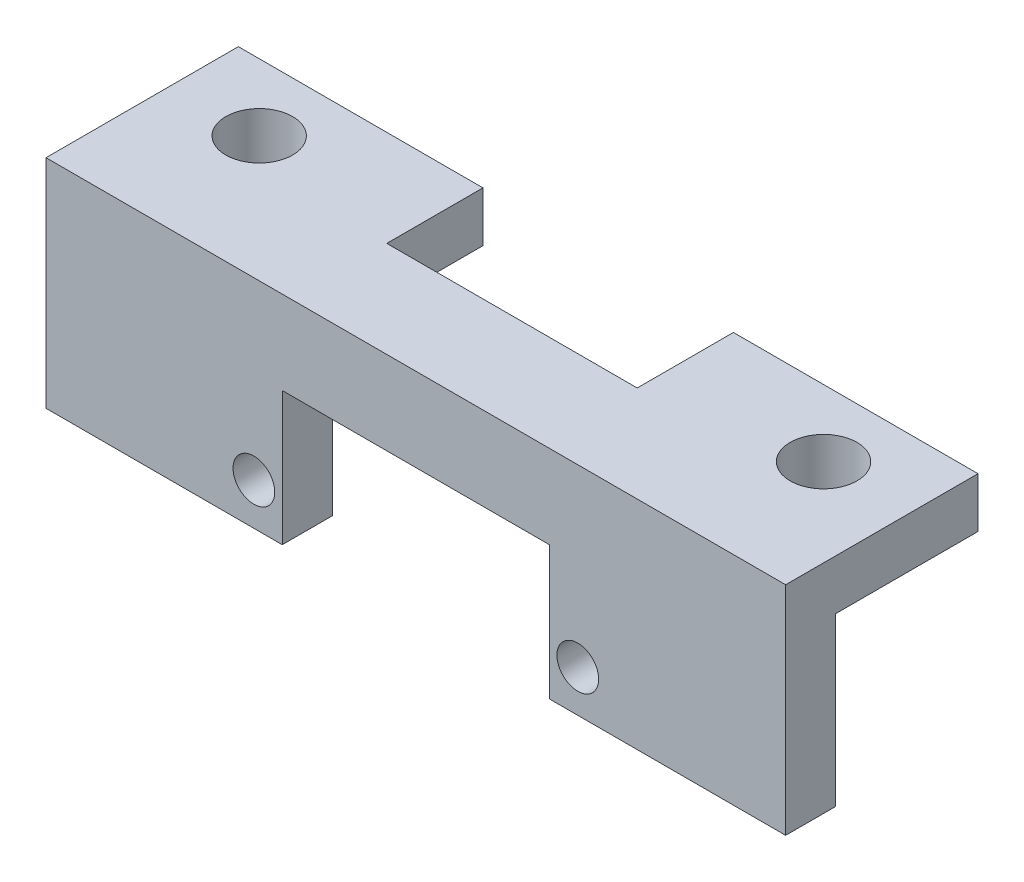
ISO-10303-21;
HEADER;
FILE_DESCRIPTION(('STEP AP214'),'2;1');
FILE_NAME('part.step','',(''),(''),'','','');
FILE_SCHEMA(('AUTOMOTIVE_DESIGN { 1 0 10303 214 1 1 1 1 }'));
ENDSEC;
DATA;
#1=APPLICATION_CONTEXT('core data for automotive mechanical design processes');
#2=APPLICATION_PROTOCOL_DEFINITION('international standard','automotive_design',2000,#1);
#3=PRODUCT_CONTEXT('',#1,'mechanical');
#4=PRODUCT('Part','Part','',(#3));
#5=PRODUCT_RELATED_PRODUCT_CATEGORY('part','',(#4));
#6=PRODUCT_DEFINITION_FORMATION('','',#4);
#7=PRODUCT_DEFINITION_CONTEXT('part definition',#1,'design');
#8=PRODUCT_DEFINITION('design','',#6,#7);
#9=PRODUCT_DEFINITION_SHAPE('','',#8);
#10=(LENGTH_UNIT() NAMED_UNIT(*) SI_UNIT(.MILLI.,.METRE.));
#11=(NAMED_UNIT(*) PLANE_ANGLE_UNIT() SI_UNIT($,.RADIAN.));
#12=(NAMED_UNIT(*) SI_UNIT($,.STERADIAN.) SOLID_ANGLE_UNIT());
#13=UNCERTAINTY_MEASURE_WITH_UNIT(LENGTH_MEASURE(1.E-05),#10,'distance_accuracy_value','');
#14=(GEOMETRIC_REPRESENTATION_CONTEXT(3) GLOBAL_UNCERTAINTY_ASSIGNED_CONTEXT((#13)) GLOBAL_UNIT_ASSIGNED_CONTEXT((#10,
#11,#12)) REPRESENTATION_CONTEXT('',''));
#15=CARTESIAN_POINT('',(0.,0.,0.));
#16=DIRECTION('',(0.,0.,1.));
#17=DIRECTION('',(1.,0.,0.));
#18=AXIS2_PLACEMENT_3D('',#15,#16,#17);
#19=CARTESIAN_POINT('',(0.,-10.,0.));
#20=DIRECTION('',(0.,-1.,0.));
#21=DIRECTION('',(0.,0.,-1.));
#22=AXIS2_PLACEMENT_3D('',#19,#20,#21);
#23=PLANE('',#22);
#24=DIRECTION('',(0.,0.,1.));
#25=VECTOR('',#24,1.);
#26=CARTESIAN_POINT('',(-8.,-10.,-15.1285438199983));
#27=LINE('',#26,#25);
#28=CARTESIAN_POINT('',(-8.,-10.,2.76000000000001));
#29=VERTEX_POINT('',#28);
#30=CARTESIAN_POINT('',(-8.,-10.,5.76));
#31=VERTEX_POINT('',#30);
#32=EDGE_CURVE('E138',#29,#31,#27,.T.);
#33=ORIENTED_EDGE('',*,*,#32,.T.);
#34=DIRECTION('',(-1.,0.,0.));
#35=VECTOR('',#34,1.);
#36=CARTESIAN_POINT('',(-22.15,-10.,5.76000000000001));
#37=LINE('',#36,#35);
#38=CARTESIAN_POINT('',(-22.15,-10.,5.76000000000001));
#39=VERTEX_POINT('',#38);
#40=EDGE_CURVE('E152',#31,#39,#37,.T.);
#41=ORIENTED_EDGE('',*,*,#40,.T.);
#42=DIRECTION('',(0.,0.,-1.));
#43=VECTOR('',#42,1.);
#44=CARTESIAN_POINT('',(-22.15,-10.,5.76000000000001));
#45=LINE('',#44,#43);
#46=CARTESIAN_POINT('',(-22.15,-10.,2.76));
#47=VERTEX_POINT('',#46);
#48=EDGE_CURVE('E170',#39,#47,#45,.T.);
#49=ORIENTED_EDGE('',*,*,#48,.T.);
#50=DIRECTION('',(1.,0.,0.));
#51=VECTOR('',#50,1.);
#52=CARTESIAN_POINT('',(-22.15,-10.,2.76));
#53=LINE('',#52,#51);
#54=EDGE_CURVE('E153',#47,#29,#53,.T.);
#55=ORIENTED_EDGE('',*,*,#54,.T.);
#56=EDGE_LOOP('',(#33,#41,#49,#55));
#57=FACE_BOUND('',#56,.T.);
#58=ADVANCED_FACE('F33',(#57),#23,.T.);
#59=CARTESIAN_POINT('',(0.,3.,0.));
#60=DIRECTION('',(0.,-1.,0.));
#61=DIRECTION('',(0.,0.,-1.));
#62=AXIS2_PLACEMENT_3D('',#59,#60,#61);
#63=PLANE('',#62);
#64=DIRECTION('',(0.,0.,1.));
#65=VECTOR('',#64,1.);
#66=CARTESIAN_POINT('',(-22.15,3.,-5.75999999999999));
#67=LINE('',#66,#65);
#68=CARTESIAN_POINT('',(-22.15,3.,-5.75999999999999));
#69=VERTEX_POINT('',#68);
#70=CARTESIAN_POINT('',(-22.15,3.,5.76000000000001));
#71=VERTEX_POINT('',#70);
#72=EDGE_CURVE('E190',#69,#71,#67,.T.);
#73=ORIENTED_EDGE('',*,*,#72,.T.);
#74=DIRECTION('',(1.,0.,0.));
#75=VECTOR('',#74,1.);
#76=CARTESIAN_POINT('',(22.15,3.,5.76));
#77=LINE('',#76,#75);
#78=CARTESIAN_POINT('',(22.15,3.,5.76));
#79=VERTEX_POINT('',#78);
#80=EDGE_CURVE('E193',#71,#79,#77,.T.);
#81=ORIENTED_EDGE('',*,*,#80,.T.);
#82=DIRECTION('',(0.,0.,-1.));
#83=VECTOR('',#82,1.);
#84=CARTESIAN_POINT('',(22.15,3.,-5.76));
#85=LINE('',#84,#83);
#86=CARTESIAN_POINT('',(22.15,3.,-5.76));
#87=VERTEX_POINT('',#86);
#88=EDGE_CURVE('E196',#79,#87,#85,.T.);
#89=ORIENTED_EDGE('',*,*,#88,.T.);
#90=DIRECTION('',(-1.,0.,0.));
#91=VECTOR('',#90,1.);
#92=CARTESIAN_POINT('',(22.15,3.,-5.76));
#93=LINE('',#92,#91);
#94=CARTESIAN_POINT('',(7.5,3.,-5.76));
#95=VERTEX_POINT('',#94);
#96=EDGE_CURVE('E198',#87,#95,#93,.T.);
#97=ORIENTED_EDGE('',*,*,#96,.T.);
#98=DIRECTION('',(0.,0.,1.));
#99=VECTOR('',#98,1.);
#100=CARTESIAN_POINT('',(7.5,3.,-5.76));
#101=LINE('',#100,#99);
#102=CARTESIAN_POINT('',(7.5,3.,0.));
#103=VERTEX_POINT('',#102);
#104=EDGE_CURVE('E200',#95,#103,#101,.T.);
#105=ORIENTED_EDGE('',*,*,#104,.T.);
#106=DIRECTION('',(-1.,0.,0.));
#107=VECTOR('',#106,1.);
#108=CARTESIAN_POINT('',(-7.5,3.,0.));
#109=LINE('',#108,#107);
#110=CARTESIAN_POINT('',(-7.5,3.,0.));
#111=VERTEX_POINT('',#110);
#112=EDGE_CURVE('E202',#103,#111,#109,.T.);
#113=ORIENTED_EDGE('',*,*,#112,.T.);
#114=DIRECTION('',(0.,0.,-1.));
#115=VECTOR('',#114,1.);
#116=CARTESIAN_POINT('',(-7.5,3.,-5.76));
#117=LINE('',#116,#115);
#118=CARTESIAN_POINT('',(-7.5,3.,-5.76));
#119=VERTEX_POINT('',#118);
#120=EDGE_CURVE('E204',#111,#119,#117,.T.);
#121=ORIENTED_EDGE('',*,*,#120,.T.);
#122=DIRECTION('',(-1.,0.,0.));
#123=VECTOR('',#122,1.);
#124=CARTESIAN_POINT('',(-7.5,3.,-5.76));
#125=LINE('',#124,#123);
#126=EDGE_CURVE('E206',#119,#69,#125,.T.);
#127=ORIENTED_EDGE('',*,*,#126,.T.);
#128=EDGE_LOOP('',(#73,#81,#89,#97,#105,#113,#121,#127));
#129=FACE_BOUND('',#128,.T.);
#130=CARTESIAN_POINT('',(-16.9,3.,-1.75999999999999));
#131=DIRECTION('',(0.,1.,0.));
#132=DIRECTION('',(0.,0.,1.));
#133=AXIS2_PLACEMENT_3D('',#130,#131,#132);
#134=CIRCLE('',#133,2.);
#135=CARTESIAN_POINT('',(-16.9,3.,0.240000000000005));
#136=VERTEX_POINT('',#135);
#137=EDGE_CURVE('E184',#136,#136,#134,.T.);
#138=ORIENTED_EDGE('',*,*,#137,.F.);
#139=EDGE_LOOP('',(#138));
#140=FACE_BOUND('',#139,.T.);
#141=CARTESIAN_POINT('',(16.9,3.,-1.75999999999999));
#142=DIRECTION('',(0.,1.,0.));
#143=DIRECTION('',(0.,0.,-1.));
#144=AXIS2_PLACEMENT_3D('',#141,#142,#143);
#145=CIRCLE('',#144,2.);
#146=CARTESIAN_POINT('',(16.9,3.,-3.75999999999999));
#147=VERTEX_POINT('',#146);
#148=EDGE_CURVE('E178',#147,#147,#145,.T.);
#149=ORIENTED_EDGE('',*,*,#148,.F.);
#150=EDGE_LOOP('',(#149));
#151=FACE_BOUND('',#150,.T.);
#152=ADVANCED_FACE('F293',(#129,#140,#151),#63,.F.);
#153=CARTESIAN_POINT('',(0.,0.,0.));
#154=DIRECTION('',(0.,-1.,0.));
#155=DIRECTION('',(0.,0.,-1.));
#156=AXIS2_PLACEMENT_3D('',#153,#154,#155);
#157=PLANE('',#156);
#158=DIRECTION('',(1.,0.,0.));
#159=VECTOR('',#158,1.);
#160=CARTESIAN_POINT('',(-22.15,0.,2.76));
#161=LINE('',#160,#159);
#162=CARTESIAN_POINT('',(-22.15,0.,2.76));
#163=VERTEX_POINT('',#162);
#164=CARTESIAN_POINT('',(22.15,0.,2.76000000000001));
#165=VERTEX_POINT('',#164);
#166=EDGE_CURVE('E56',#163,#165,#161,.T.);
#167=ORIENTED_EDGE('',*,*,#166,.F.);
#168=DIRECTION('',(0.,0.,1.));
#169=VECTOR('',#168,1.);
#170=CARTESIAN_POINT('',(-22.15,0.,-5.75999999999999));
#171=LINE('',#170,#169);
#172=CARTESIAN_POINT('',(-22.15,0.,-5.75999999999999));
#173=VERTEX_POINT('',#172);
#174=EDGE_CURVE('E187',#173,#163,#171,.T.);
#175=ORIENTED_EDGE('',*,*,#174,.F.);
#176=DIRECTION('',(-1.,0.,0.));
#177=VECTOR('',#176,1.);
#178=CARTESIAN_POINT('',(-7.5,0.,-5.76));
#179=LINE('',#178,#177);
#180=CARTESIAN_POINT('',(-7.5,0.,-5.76));
#181=VERTEX_POINT('',#180);
#182=EDGE_CURVE('E194',#181,#173,#179,.T.);
#183=ORIENTED_EDGE('',*,*,#182,.F.);
#184=DIRECTION('',(0.,0.,-1.));
#185=VECTOR('',#184,1.);
#186=CARTESIAN_POINT('',(-7.5,0.,-5.76));
#187=LINE('',#186,#185);
#188=CARTESIAN_POINT('',(-7.5,0.,0.));
#189=VERTEX_POINT('',#188);
#190=EDGE_CURVE('E218',#189,#181,#187,.T.);
#191=ORIENTED_EDGE('',*,*,#190,.F.);
#192=DIRECTION('',(-1.,0.,0.));
#193=VECTOR('',#192,1.);
#194=CARTESIAN_POINT('',(-7.5,0.,0.));
#195=LINE('',#194,#193);
#196=CARTESIAN_POINT('',(7.5,0.,0.));
#197=VERTEX_POINT('',#196);
#198=EDGE_CURVE('E216',#197,#189,#195,.T.);
#199=ORIENTED_EDGE('',*,*,#198,.F.);
#200=DIRECTION('',(0.,0.,1.));
#201=VECTOR('',#200,1.);
#202=CARTESIAN_POINT('',(7.5,0.,-5.76));
#203=LINE('',#202,#201);
#204=CARTESIAN_POINT('',(7.5,0.,-5.76));
#205=VERTEX_POINT('',#204);
#206=EDGE_CURVE('E214',#205,#197,#203,.T.);
#207=ORIENTED_EDGE('',*,*,#206,.F.);
#208=DIRECTION('',(-1.,0.,0.));
#209=VECTOR('',#208,1.);
#210=CARTESIAN_POINT('',(22.15,0.,-5.76));
#211=LINE('',#210,#209);
#212=CARTESIAN_POINT('',(22.15,0.,-5.76));
#213=VERTEX_POINT('',#212);
#214=EDGE_CURVE('E212',#213,#205,#211,.T.);
#215=ORIENTED_EDGE('',*,*,#214,.F.);
#216=DIRECTION('',(0.,0.,-1.));
#217=VECTOR('',#216,1.);
#218=CARTESIAN_POINT('',(22.15,0.,-5.76));
#219=LINE('',#218,#217);
#220=EDGE_CURVE('E210',#165,#213,#219,.T.);
#221=ORIENTED_EDGE('',*,*,#220,.F.);
#222=EDGE_LOOP('',(#167,#175,#183,#191,#199,#207,#215,#221));
#223=FACE_BOUND('',#222,.T.);
#224=CARTESIAN_POINT('',(-16.9,0.,-1.75999999999999));
#225=DIRECTION('',(0.,1.,0.));
#226=DIRECTION('',(0.,0.,1.));
#227=AXIS2_PLACEMENT_3D('',#224,#225,#226);
#228=CIRCLE('',#227,2.);
#229=CARTESIAN_POINT('',(-16.9,0.,0.240000000000005));
#230=VERTEX_POINT('',#229);
#231=EDGE_CURVE('E181',#230,#230,#228,.T.);
#232=ORIENTED_EDGE('',*,*,#231,.T.);
#233=EDGE_LOOP('',(#232));
#234=FACE_BOUND('',#233,.T.);
#235=CARTESIAN_POINT('',(16.9,0.,-1.75999999999999));
#236=DIRECTION('',(0.,1.,0.));
#237=DIRECTION('',(0.,0.,-1.));
#238=AXIS2_PLACEMENT_3D('',#235,#236,#237);
#239=CIRCLE('',#238,2.);
#240=CARTESIAN_POINT('',(16.9,0.,-3.75999999999999));
#241=VERTEX_POINT('',#240);
#242=EDGE_CURVE('E177',#241,#241,#239,.T.);
#243=ORIENTED_EDGE('',*,*,#242,.T.);
#244=EDGE_LOOP('',(#243));
#245=FACE_BOUND('',#244,.T.);
#246=ADVANCED_FACE('F290',(#223,#234,#245),#157,.T.);
#247=CARTESIAN_POINT('',(-22.15,3.,-5.75999999999999));
#248=DIRECTION('',(1.,0.,0.));
#249=DIRECTION('',(0.,0.,-1.));
#250=AXIS2_PLACEMENT_3D('',#247,#248,#249);
#251=PLANE('',#250);
#252=ORIENTED_EDGE('',*,*,#174,.T.);
#253=DIRECTION('',(0.,1.,0.));
#254=VECTOR('',#253,1.);
#255=CARTESIAN_POINT('',(-22.15,-10.,2.76));
#256=LINE('',#255,#254);
#257=EDGE_CURVE('E174',#47,#163,#256,.T.);
#258=ORIENTED_EDGE('',*,*,#257,.F.);
#259=ORIENTED_EDGE('',*,*,#48,.F.);
#260=DIRECTION('',(0.,-1.,0.));
#261=VECTOR('',#260,1.);
#262=CARTESIAN_POINT('',(-22.15,3.,5.76000000000001));
#263=LINE('',#262,#261);
#264=EDGE_CURVE('E11',#71,#39,#263,.T.);
#265=ORIENTED_EDGE('',*,*,#264,.F.);
#266=ORIENTED_EDGE('',*,*,#72,.F.);
#267=DIRECTION('',(0.,-1.,0.));
#268=VECTOR('',#267,1.);
#269=CARTESIAN_POINT('',(-22.15,3.,-5.75999999999999));
#270=LINE('',#269,#268);
#271=EDGE_CURVE('E208',#69,#173,#270,.T.);
#272=ORIENTED_EDGE('',*,*,#271,.T.);
#273=EDGE_LOOP('',(#252,#258,#259,#265,#266,#272));
#274=FACE_BOUND('',#273,.T.);
#275=ADVANCED_FACE('F35',(#274),#251,.F.);
#276=CARTESIAN_POINT('',(22.15,3.,5.76));
#277=DIRECTION('',(0.,0.,-1.));
#278=DIRECTION('',(-1.,0.,0.));
#279=AXIS2_PLACEMENT_3D('',#276,#277,#278);
#280=PLANE('',#279);
#281=CARTESIAN_POINT('',(9.7,-7.5,5.76));
#282=DIRECTION('',(0.,0.,1.));
#283=DIRECTION('',(-1.,0.,0.));
#284=AXIS2_PLACEMENT_3D('',#281,#282,#283);
#285=CIRCLE('',#284,1.25);
#286=CARTESIAN_POINT('',(10.95,-7.5,5.76));
#287=VERTEX_POINT('',#286);
#288=EDGE_CURVE('E272',#287,#287,#285,.T.);
#289=ORIENTED_EDGE('',*,*,#288,.F.);
#290=EDGE_LOOP('',(#289));
#291=FACE_BOUND('',#290,.T.);
#292=CARTESIAN_POINT('',(-9.7,-7.5,5.76));
#293=DIRECTION('',(0.,0.,1.));
#294=DIRECTION('',(1.,0.,0.));
#295=AXIS2_PLACEMENT_3D('',#292,#293,#294);
#296=CIRCLE('',#295,1.25);
#297=CARTESIAN_POINT('',(-8.45,-7.5,5.76));
#298=VERTEX_POINT('',#297);
#299=EDGE_CURVE('E271',#298,#298,#296,.T.);
#300=ORIENTED_EDGE('',*,*,#299,.F.);
#301=EDGE_LOOP('',(#300));
#302=FACE_BOUND('',#301,.T.);
#303=ORIENTED_EDGE('',*,*,#40,.F.);
#304=DIRECTION('',(0.,-1.,0.));
#305=VECTOR('',#304,1.);
#306=CARTESIAN_POINT('',(-8.,-2.,5.76));
#307=LINE('',#306,#305);
#308=CARTESIAN_POINT('',(-8.,-2.,5.76));
#309=VERTEX_POINT('',#308);
#310=EDGE_CURVE('E135',#309,#31,#307,.T.);
#311=ORIENTED_EDGE('',*,*,#310,.F.);
#312=DIRECTION('',(-1.,0.,0.));
#313=VECTOR('',#312,1.);
#314=CARTESIAN_POINT('',(-8.,-2.,5.76));
#315=LINE('',#314,#313);
#316=CARTESIAN_POINT('',(8.,-2.,5.76));
#317=VERTEX_POINT('',#316);
#318=EDGE_CURVE('E155',#317,#309,#315,.T.);
#319=ORIENTED_EDGE('',*,*,#318,.F.);
#320=DIRECTION('',(0.,1.,0.));
#321=VECTOR('',#320,1.);
#322=CARTESIAN_POINT('',(8.,-2.,5.76));
#323=LINE('',#322,#321);
#324=CARTESIAN_POINT('',(8.00000000000001,-10.,5.76));
#325=VERTEX_POINT('',#324);
#326=EDGE_CURVE('E146',#325,#317,#323,.T.);
#327=ORIENTED_EDGE('',*,*,#326,.F.);
#328=CARTESIAN_POINT('',(22.15,-10.,5.76000000000001));
#329=VERTEX_POINT('',#328);
#330=EDGE_CURVE('E160',#329,#325,#37,.T.);
#331=ORIENTED_EDGE('',*,*,#330,.F.);
#332=DIRECTION('',(0.,-1.,0.));
#333=VECTOR('',#332,1.);
#334=CARTESIAN_POINT('',(22.15,3.,5.76));
#335=LINE('',#334,#333);
#336=EDGE_CURVE('E41',#79,#329,#335,.T.);
#337=ORIENTED_EDGE('',*,*,#336,.F.);
#338=ORIENTED_EDGE('',*,*,#80,.F.);
#339=ORIENTED_EDGE('',*,*,#264,.T.);
#340=EDGE_LOOP('',(#303,#311,#319,#327,#331,#337,#338,#339));
#341=FACE_BOUND('',#340,.T.);
#342=ADVANCED_FACE('F157',(#291,#302,#341),#280,.F.);
#343=CARTESIAN_POINT('',(22.15,3.,-5.76));
#344=DIRECTION('',(-1.,0.,0.));
#345=DIRECTION('',(0.,0.,1.));
#346=AXIS2_PLACEMENT_3D('',#343,#344,#345);
#347=PLANE('',#346);
#348=ORIENTED_EDGE('',*,*,#336,.T.);
#349=DIRECTION('',(0.,0.,1.));
#350=VECTOR('',#349,1.);
#351=CARTESIAN_POINT('',(22.15,-10.,5.76000000000001));
#352=LINE('',#351,#350);
#353=CARTESIAN_POINT('',(22.15,-10.,2.76000000000001));
#354=VERTEX_POINT('',#353);
#355=EDGE_CURVE('E161',#354,#329,#352,.T.);
#356=ORIENTED_EDGE('',*,*,#355,.F.);
#357=DIRECTION('',(0.,1.,0.));
#358=VECTOR('',#357,1.);
#359=CARTESIAN_POINT('',(22.15,-10.,2.76000000000001));
#360=LINE('',#359,#358);
#361=EDGE_CURVE('E164',#354,#165,#360,.T.);
#362=ORIENTED_EDGE('',*,*,#361,.T.);
#363=ORIENTED_EDGE('',*,*,#220,.T.);
#364=DIRECTION('',(0.,-1.,0.));
#365=VECTOR('',#364,1.);
#366=CARTESIAN_POINT('',(22.15,3.,-5.76));
#367=LINE('',#366,#365);
#368=EDGE_CURVE('E235',#87,#213,#367,.T.);
#369=ORIENTED_EDGE('',*,*,#368,.F.);
#370=ORIENTED_EDGE('',*,*,#88,.F.);
#371=EDGE_LOOP('',(#348,#356,#362,#363,#369,#370));
#372=FACE_BOUND('',#371,.T.);
#373=ADVANCED_FACE('F241',(#372),#347,.F.);
#374=CARTESIAN_POINT('',(22.15,3.,-5.76));
#375=DIRECTION('',(0.,0.,1.));
#376=DIRECTION('',(1.,0.,0.));
#377=AXIS2_PLACEMENT_3D('',#374,#375,#376);
#378=PLANE('',#377);
#379=ORIENTED_EDGE('',*,*,#214,.T.);
#380=DIRECTION('',(0.,-1.,0.));
#381=VECTOR('',#380,1.);
#382=CARTESIAN_POINT('',(7.5,3.,-5.76));
#383=LINE('',#382,#381);
#384=EDGE_CURVE('E232',#95,#205,#383,.T.);
#385=ORIENTED_EDGE('',*,*,#384,.F.);
#386=ORIENTED_EDGE('',*,*,#96,.F.);
#387=ORIENTED_EDGE('',*,*,#368,.T.);
#388=EDGE_LOOP('',(#379,#385,#386,#387));
#389=FACE_BOUND('',#388,.T.);
#390=ADVANCED_FACE('F288',(#389),#378,.F.);
#391=CARTESIAN_POINT('',(7.5,3.,-5.76));
#392=DIRECTION('',(1.,0.,0.));
#393=DIRECTION('',(0.,0.,-1.));
#394=AXIS2_PLACEMENT_3D('',#391,#392,#393);
#395=PLANE('',#394);
#396=ORIENTED_EDGE('',*,*,#206,.T.);
#397=DIRECTION('',(0.,-1.,0.));
#398=VECTOR('',#397,1.);
#399=CARTESIAN_POINT('',(7.5,3.,0.));
#400=LINE('',#399,#398);
#401=EDGE_CURVE('E229',#103,#197,#400,.T.);
#402=ORIENTED_EDGE('',*,*,#401,.F.);
#403=ORIENTED_EDGE('',*,*,#104,.F.);
#404=ORIENTED_EDGE('',*,*,#384,.T.);
#405=EDGE_LOOP('',(#396,#402,#403,#404));
#406=FACE_BOUND('',#405,.T.);
#407=ADVANCED_FACE('F335',(#406),#395,.F.);
#408=CARTESIAN_POINT('',(-7.5,3.,0.));
#409=DIRECTION('',(0.,0.,1.));
#410=DIRECTION('',(1.,0.,0.));
#411=AXIS2_PLACEMENT_3D('',#408,#409,#410);
#412=PLANE('',#411);
#413=ORIENTED_EDGE('',*,*,#198,.T.);
#414=DIRECTION('',(0.,-1.,0.));
#415=VECTOR('',#414,1.);
#416=CARTESIAN_POINT('',(-7.5,3.,0.));
#417=LINE('',#416,#415);
#418=EDGE_CURVE('E226',#111,#189,#417,.T.);
#419=ORIENTED_EDGE('',*,*,#418,.F.);
#420=ORIENTED_EDGE('',*,*,#112,.F.);
#421=ORIENTED_EDGE('',*,*,#401,.T.);
#422=EDGE_LOOP('',(#413,#419,#420,#421));
#423=FACE_BOUND('',#422,.T.);
#424=ADVANCED_FACE('F331',(#423),#412,.F.);
#425=CARTESIAN_POINT('',(-7.5,3.,-5.76));
#426=DIRECTION('',(-1.,0.,0.));
#427=DIRECTION('',(0.,0.,1.));
#428=AXIS2_PLACEMENT_3D('',#425,#426,#427);
#429=PLANE('',#428);
#430=ORIENTED_EDGE('',*,*,#190,.T.);
#431=DIRECTION('',(0.,-1.,0.));
#432=VECTOR('',#431,1.);
#433=CARTESIAN_POINT('',(-7.5,3.,-5.76));
#434=LINE('',#433,#432);
#435=EDGE_CURVE('E223',#119,#181,#434,.T.);
#436=ORIENTED_EDGE('',*,*,#435,.F.);
#437=ORIENTED_EDGE('',*,*,#120,.F.);
#438=ORIENTED_EDGE('',*,*,#418,.T.);
#439=EDGE_LOOP('',(#430,#436,#437,#438));
#440=FACE_BOUND('',#439,.T.);
#441=ADVANCED_FACE('F327',(#440),#429,.F.);
#442=CARTESIAN_POINT('',(-7.5,3.,-5.76));
#443=DIRECTION('',(0.,0.,1.));
#444=DIRECTION('',(1.,0.,0.));
#445=AXIS2_PLACEMENT_3D('',#442,#443,#444);
#446=PLANE('',#445);
#447=ORIENTED_EDGE('',*,*,#182,.T.);
#448=ORIENTED_EDGE('',*,*,#271,.F.);
#449=ORIENTED_EDGE('',*,*,#126,.F.);
#450=ORIENTED_EDGE('',*,*,#435,.T.);
#451=EDGE_LOOP('',(#447,#448,#449,#450));
#452=FACE_BOUND('',#451,.T.);
#453=ADVANCED_FACE('F320',(#452),#446,.F.);
#454=CARTESIAN_POINT('',(-16.9,3.,-1.75999999999999));
#455=DIRECTION('',(0.,-1.,0.));
#456=DIRECTION('',(0.,0.,-1.));
#457=AXIS2_PLACEMENT_3D('',#454,#455,#456);
#458=CYLINDRICAL_SURFACE('',#457,2.);
#459=ORIENTED_EDGE('',*,*,#137,.T.);
#460=EDGE_LOOP('',(#459));
#461=FACE_BOUND('',#460,.T.);
#462=ORIENTED_EDGE('',*,*,#231,.F.);
#463=EDGE_LOOP('',(#462));
#464=FACE_BOUND('',#463,.T.);
#465=ADVANCED_FACE('F313',(#461,#464),#458,.F.);
#466=CARTESIAN_POINT('',(16.9,3.,-1.75999999999999));
#467=DIRECTION('',(0.,-1.,0.));
#468=DIRECTION('',(0.,0.,-1.));
#469=AXIS2_PLACEMENT_3D('',#466,#467,#468);
#470=CYLINDRICAL_SURFACE('',#469,2.);
#471=ORIENTED_EDGE('',*,*,#148,.T.);
#472=EDGE_LOOP('',(#471));
#473=FACE_BOUND('',#472,.T.);
#474=ORIENTED_EDGE('',*,*,#242,.F.);
#475=EDGE_LOOP('',(#474));
#476=FACE_BOUND('',#475,.T.);
#477=ADVANCED_FACE('F308',(#473,#476),#470,.F.);
#478=CARTESIAN_POINT('',(-22.15,-10.,2.76));
#479=DIRECTION('',(0.,0.,1.));
#480=DIRECTION('',(1.,0.,0.));
#481=AXIS2_PLACEMENT_3D('',#478,#479,#480);
#482=PLANE('',#481);
#483=CARTESIAN_POINT('',(9.7,-7.5,2.76000000000001));
#484=DIRECTION('',(0.,0.,1.));
#485=DIRECTION('',(1.,0.,0.));
#486=AXIS2_PLACEMENT_3D('',#483,#484,#485);
#487=CIRCLE('',#486,1.25);
#488=CARTESIAN_POINT('',(10.95,-7.5,2.76000000000001));
#489=VERTEX_POINT('',#488);
#490=EDGE_CURVE('E268',#489,#489,#487,.F.);
#491=ORIENTED_EDGE('',*,*,#490,.F.);
#492=EDGE_LOOP('',(#491));
#493=FACE_BOUND('',#492,.T.);
#494=CARTESIAN_POINT('',(-9.7,-7.5,2.76000000000001));
#495=DIRECTION('',(0.,0.,1.));
#496=DIRECTION('',(1.,0.,0.));
#497=AXIS2_PLACEMENT_3D('',#494,#495,#496);
#498=CIRCLE('',#497,1.25);
#499=CARTESIAN_POINT('',(-8.45,-7.5,2.76000000000001));
#500=VERTEX_POINT('',#499);
#501=EDGE_CURVE('E147',#500,#500,#498,.F.);
#502=ORIENTED_EDGE('',*,*,#501,.F.);
#503=EDGE_LOOP('',(#502));
#504=FACE_BOUND('',#503,.T.);
#505=DIRECTION('',(1.,0.,0.));
#506=VECTOR('',#505,1.);
#507=CARTESIAN_POINT('',(-8.,-2.,2.76000000000001));
#508=LINE('',#507,#506);
#509=CARTESIAN_POINT('',(-8.,-2.,2.76000000000001));
#510=VERTEX_POINT('',#509);
#511=CARTESIAN_POINT('',(8.,-2.,2.76000000000001));
#512=VERTEX_POINT('',#511);
#513=EDGE_CURVE('E264',#510,#512,#508,.T.);
#514=ORIENTED_EDGE('',*,*,#513,.F.);
#515=DIRECTION('',(0.,1.,0.));
#516=VECTOR('',#515,1.);
#517=CARTESIAN_POINT('',(-8.,-2.,2.76000000000001));
#518=LINE('',#517,#516);
#519=EDGE_CURVE('E171',#29,#510,#518,.T.);
#520=ORIENTED_EDGE('',*,*,#519,.F.);
#521=ORIENTED_EDGE('',*,*,#54,.F.);
#522=ORIENTED_EDGE('',*,*,#257,.T.);
#523=ORIENTED_EDGE('',*,*,#166,.T.);
#524=ORIENTED_EDGE('',*,*,#361,.F.);
#525=CARTESIAN_POINT('',(8.,-10.,2.76000000000001));
#526=VERTEX_POINT('',#525);
#527=EDGE_CURVE('E247',#526,#354,#53,.T.);
#528=ORIENTED_EDGE('',*,*,#527,.F.);
#529=DIRECTION('',(0.,-1.,0.));
#530=VECTOR('',#529,1.);
#531=CARTESIAN_POINT('',(8.,-2.,2.76000000000001));
#532=LINE('',#531,#530);
#533=EDGE_CURVE('E48',#512,#526,#532,.T.);
#534=ORIENTED_EDGE('',*,*,#533,.F.);
#535=EDGE_LOOP('',(#514,#520,#521,#522,#523,#524,#528,#534));
#536=FACE_BOUND('',#535,.T.);
#537=ADVANCED_FACE('F263',(#493,#504,#536),#482,.F.);
#538=DIRECTION('',(0.,0.,1.));
#539=VECTOR('',#538,1.);
#540=CARTESIAN_POINT('',(8.00000000000001,-10.,-15.1285438199983));
#541=LINE('',#540,#539);
#542=EDGE_CURVE('E154',#526,#325,#541,.T.);
#543=ORIENTED_EDGE('',*,*,#542,.F.);
#544=ORIENTED_EDGE('',*,*,#527,.T.);
#545=ORIENTED_EDGE('',*,*,#355,.T.);
#546=ORIENTED_EDGE('',*,*,#330,.T.);
#547=EDGE_LOOP('',(#543,#544,#545,#546));
#548=FACE_BOUND('',#547,.T.);
#549=ADVANCED_FACE('F245',(#548),#23,.T.);
#550=CARTESIAN_POINT('',(-8.,-2.,-15.1285438199983));
#551=DIRECTION('',(-1.,0.,0.));
#552=DIRECTION('',(0.,-1.,0.));
#553=AXIS2_PLACEMENT_3D('',#550,#551,#552);
#554=PLANE('',#553);
#555=ORIENTED_EDGE('',*,*,#519,.T.);
#556=DIRECTION('',(0.,0.,1.));
#557=VECTOR('',#556,1.);
#558=CARTESIAN_POINT('',(-8.,-2.,-15.1285438199983));
#559=LINE('',#558,#557);
#560=EDGE_CURVE('E141',#510,#309,#559,.T.);
#561=ORIENTED_EDGE('',*,*,#560,.T.);
#562=ORIENTED_EDGE('',*,*,#310,.T.);
#563=ORIENTED_EDGE('',*,*,#32,.F.);
#564=EDGE_LOOP('',(#555,#561,#562,#563));
#565=FACE_BOUND('',#564,.T.);
#566=ADVANCED_FACE('F137',(#565),#554,.F.);
#567=CARTESIAN_POINT('',(-8.,-2.,-15.1285438199983));
#568=DIRECTION('',(0.,1.,0.));
#569=DIRECTION('',(0.,0.,1.));
#570=AXIS2_PLACEMENT_3D('',#567,#568,#569);
#571=PLANE('',#570);
#572=ORIENTED_EDGE('',*,*,#513,.T.);
#573=DIRECTION('',(0.,0.,1.));
#574=VECTOR('',#573,1.);
#575=CARTESIAN_POINT('',(8.,-2.,-15.1285438199983));
#576=LINE('',#575,#574);
#577=EDGE_CURVE('E256',#512,#317,#576,.T.);
#578=ORIENTED_EDGE('',*,*,#577,.T.);
#579=ORIENTED_EDGE('',*,*,#318,.T.);
#580=ORIENTED_EDGE('',*,*,#560,.F.);
#581=EDGE_LOOP('',(#572,#578,#579,#580));
#582=FACE_BOUND('',#581,.T.);
#583=ADVANCED_FACE('F307',(#582),#571,.F.);
#584=CARTESIAN_POINT('',(8.,-2.,-15.1285438199983));
#585=DIRECTION('',(1.,0.,0.));
#586=DIRECTION('',(0.,1.,0.));
#587=AXIS2_PLACEMENT_3D('',#584,#585,#586);
#588=PLANE('',#587);
#589=ORIENTED_EDGE('',*,*,#533,.T.);
#590=ORIENTED_EDGE('',*,*,#542,.T.);
#591=ORIENTED_EDGE('',*,*,#326,.T.);
#592=ORIENTED_EDGE('',*,*,#577,.F.);
#593=EDGE_LOOP('',(#589,#590,#591,#592));
#594=FACE_BOUND('',#593,.T.);
#595=ADVANCED_FACE('F448',(#594),#588,.F.);
#596=CARTESIAN_POINT('',(-9.7,-7.5,-15.1285438199983));
#597=DIRECTION('',(0.,0.,1.));
#598=DIRECTION('',(1.,0.,0.));
#599=AXIS2_PLACEMENT_3D('',#596,#597,#598);
#600=CYLINDRICAL_SURFACE('',#599,1.25);
#601=CARTESIAN_POINT('',(-8.45,-7.5,2.76000000000001));
#602=CARTESIAN_POINT('',(-8.45,-7.5,2.79125000000001));
#603=CARTESIAN_POINT('',(-8.45,-7.5,2.82250000000001));
#604=CARTESIAN_POINT('',(-8.45,-7.5,2.88500000000001));
#605=CARTESIAN_POINT('',(-8.45,-7.5,2.91625000000001));
#606=CARTESIAN_POINT('',(-8.45,-7.5,2.97875000000001));
#607=CARTESIAN_POINT('',(-8.45,-7.5,3.01000000000001));
#608=CARTESIAN_POINT('',(-8.45,-7.5,3.07250000000001));
#609=CARTESIAN_POINT('',(-8.45,-7.5,3.10375000000001));
#610=CARTESIAN_POINT('',(-8.45,-7.5,3.16625000000001));
#611=CARTESIAN_POINT('',(-8.45,-7.5,3.19750000000001));
#612=CARTESIAN_POINT('',(-8.45,-7.5,3.26000000000001));
#613=CARTESIAN_POINT('',(-8.45,-7.5,3.29125000000001));
#614=CARTESIAN_POINT('',(-8.45,-7.5,3.35375000000001));
#615=CARTESIAN_POINT('',(-8.45,-7.5,3.38500000000001));
#616=CARTESIAN_POINT('',(-8.45,-7.5,3.44750000000001));
#617=CARTESIAN_POINT('',(-8.45,-7.5,3.47875000000001));
#618=CARTESIAN_POINT('',(-8.45,-7.5,3.54125000000001));
#619=CARTESIAN_POINT('',(-8.45,-7.5,3.57250000000001));
#620=CARTESIAN_POINT('',(-8.45,-7.5,3.63500000000001));
#621=CARTESIAN_POINT('',(-8.45,-7.5,3.66625000000001));
#622=CARTESIAN_POINT('',(-8.45,-7.5,3.72875000000001));
#623=CARTESIAN_POINT('',(-8.45,-7.5,3.76000000000001));
#624=CARTESIAN_POINT('',(-8.45,-7.5,3.82250000000001));
#625=CARTESIAN_POINT('',(-8.45,-7.5,3.85375));
#626=CARTESIAN_POINT('',(-8.45,-7.5,3.91625));
#627=CARTESIAN_POINT('',(-8.45,-7.5,3.9475));
#628=CARTESIAN_POINT('',(-8.45,-7.5,4.01));
#629=CARTESIAN_POINT('',(-8.45,-7.5,4.04125));
#630=CARTESIAN_POINT('',(-8.45,-7.5,4.10375));
#631=CARTESIAN_POINT('',(-8.45,-7.5,4.135));
#632=CARTESIAN_POINT('',(-8.45,-7.5,4.1975));
#633=CARTESIAN_POINT('',(-8.45,-7.5,4.22875));
#634=CARTESIAN_POINT('',(-8.45,-7.5,4.29125));
#635=CARTESIAN_POINT('',(-8.45,-7.5,4.3225));
#636=CARTESIAN_POINT('',(-8.45,-7.5,4.385));
#637=CARTESIAN_POINT('',(-8.45,-7.5,4.41625));
#638=CARTESIAN_POINT('',(-8.45,-7.5,4.47875));
#639=CARTESIAN_POINT('',(-8.45,-7.5,4.51));
#640=CARTESIAN_POINT('',(-8.45,-7.5,4.5725));
#641=CARTESIAN_POINT('',(-8.45,-7.5,4.60375));
#642=CARTESIAN_POINT('',(-8.45,-7.5,4.66625));
#643=CARTESIAN_POINT('',(-8.45,-7.5,4.6975));
#644=CARTESIAN_POINT('',(-8.45,-7.5,4.76));
#645=CARTESIAN_POINT('',(-8.45,-7.5,4.79125));
#646=CARTESIAN_POINT('',(-8.45,-7.5,4.85375));
#647=CARTESIAN_POINT('',(-8.45,-7.5,4.885));
#648=CARTESIAN_POINT('',(-8.45,-7.5,4.9475));
#649=CARTESIAN_POINT('',(-8.45,-7.5,4.97875));
#650=CARTESIAN_POINT('',(-8.45,-7.5,5.04125));
#651=CARTESIAN_POINT('',(-8.45,-7.5,5.0725));
#652=CARTESIAN_POINT('',(-8.45,-7.5,5.135));
#653=CARTESIAN_POINT('',(-8.45,-7.5,5.16625));
#654=CARTESIAN_POINT('',(-8.45,-7.5,5.22875));
#655=CARTESIAN_POINT('',(-8.45,-7.5,5.26));
#656=CARTESIAN_POINT('',(-8.45,-7.5,5.3225));
#657=CARTESIAN_POINT('',(-8.45,-7.5,5.35375));
#658=CARTESIAN_POINT('',(-8.45,-7.5,5.41625));
#659=CARTESIAN_POINT('',(-8.45,-7.5,5.4475));
#660=CARTESIAN_POINT('',(-8.45,-7.5,5.51));
#661=CARTESIAN_POINT('',(-8.45,-7.5,5.54125));
#662=CARTESIAN_POINT('',(-8.45,-7.5,5.60375));
#663=CARTESIAN_POINT('',(-8.45,-7.5,5.635));
#664=CARTESIAN_POINT('',(-8.45,-7.5,5.6975));
#665=CARTESIAN_POINT('',(-8.45,-7.5,5.72875));
#666=CARTESIAN_POINT('',(-8.45,-7.5,5.76));
#667=B_SPLINE_CURVE_WITH_KNOTS('',3,(#601,#602,#603,#604,#605,#606,#607,#608,#609,#610,#611,
#612,#613,#614,#615,#616,#617,#618,#619,#620,#621,#622,#623,#624,#625,#626,#627,#628,#629,#630,
#631,#632,#633,#634,#635,#636,#637,#638,#639,#640,#641,#642,#643,#644,#645,#646,#647,#648,#649,
#650,#651,#652,#653,#654,#655,#656,#657,#658,#659,#660,#661,#662,#663,#664,#665,#666),
.UNSPECIFIED.,.F.,.F.,(4,2,2,2,2,2,2,2,2,2,2,2,2,2,2,2,2,2,2,2,2,2,2,2,2,2,2,2,2,2,2,2,4),(0.,
0.0937500000000001,0.1875,0.28125,0.375,0.468749999999997,0.562499999999997,0.656249999999997,
0.749999999999997,0.843749999999997,0.937499999999997,1.03125,1.12499999999999,1.21874999999999,
1.31249999999999,1.40624999999999,1.49999999999999,1.59374999999999,1.68749999999999,
1.78124999999999,1.87499999999999,1.96874999999999,2.06249999999999,2.15624999999999,
2.24999999999999,2.34374999999999,2.43749999999999,2.53124999999999,2.62499999999999,
2.71874999999999,2.81249999999999,2.90624999999999,2.99999999999999),.UNSPECIFIED.);
#668=EDGE_CURVE('BSEAM280',#500,#298,#667,.T.);
#669=ORIENTED_EDGE('',*,*,#501,.T.);
#670=ORIENTED_EDGE('',*,*,#299,.T.);
#671=ORIENTED_EDGE('',*,*,#668,.T.);
#672=ORIENTED_EDGE('',*,*,#668,.F.);
#673=EDGE_LOOP('',(#669,#671,#670,#672));
#674=FACE_BOUND('',#673,.T.);
#675=ADVANCED_FACE('F280',(#674),#600,.F.);
#676=CARTESIAN_POINT('',(9.7,-7.5,-15.1285438199983));
#677=DIRECTION('',(0.,0.,1.));
#678=DIRECTION('',(1.,0.,0.));
#679=AXIS2_PLACEMENT_3D('',#676,#677,#678);
#680=CYLINDRICAL_SURFACE('',#679,1.25);
#681=CARTESIAN_POINT('',(10.95,-7.5,2.76000000000001));
#682=CARTESIAN_POINT('',(10.95,-7.5,2.79125000000001));
#683=CARTESIAN_POINT('',(10.95,-7.5,2.82250000000001));
#684=CARTESIAN_POINT('',(10.95,-7.5,2.88500000000001));
#685=CARTESIAN_POINT('',(10.95,-7.5,2.91625000000001));
#686=CARTESIAN_POINT('',(10.95,-7.5,2.97875000000001));
#687=CARTESIAN_POINT('',(10.95,-7.5,3.01000000000001));
#688=CARTESIAN_POINT('',(10.95,-7.5,3.07250000000001));
#689=CARTESIAN_POINT('',(10.95,-7.5,3.10375000000001));
#690=CARTESIAN_POINT('',(10.95,-7.5,3.16625000000001));
#691=CARTESIAN_POINT('',(10.95,-7.5,3.19750000000001));
#692=CARTESIAN_POINT('',(10.95,-7.5,3.26000000000001));
#693=CARTESIAN_POINT('',(10.95,-7.5,3.29125000000001));
#694=CARTESIAN_POINT('',(10.95,-7.5,3.35375000000001));
#695=CARTESIAN_POINT('',(10.95,-7.5,3.38500000000001));
#696=CARTESIAN_POINT('',(10.95,-7.5,3.44750000000001));
#697=CARTESIAN_POINT('',(10.95,-7.5,3.47875000000001));
#698=CARTESIAN_POINT('',(10.95,-7.5,3.54125000000001));
#699=CARTESIAN_POINT('',(10.95,-7.5,3.57250000000001));
#700=CARTESIAN_POINT('',(10.95,-7.5,3.63500000000001));
#701=CARTESIAN_POINT('',(10.95,-7.5,3.66625000000001));
#702=CARTESIAN_POINT('',(10.95,-7.5,3.72875000000001));
#703=CARTESIAN_POINT('',(10.95,-7.5,3.76000000000001));
#704=CARTESIAN_POINT('',(10.95,-7.5,3.82250000000001));
#705=CARTESIAN_POINT('',(10.95,-7.5,3.85375));
#706=CARTESIAN_POINT('',(10.95,-7.5,3.91625));
#707=CARTESIAN_POINT('',(10.95,-7.5,3.9475));
#708=CARTESIAN_POINT('',(10.95,-7.5,4.01));
#709=CARTESIAN_POINT('',(10.95,-7.5,4.04125));
#710=CARTESIAN_POINT('',(10.95,-7.5,4.10375));
#711=CARTESIAN_POINT('',(10.95,-7.5,4.135));
#712=CARTESIAN_POINT('',(10.95,-7.5,4.1975));
#713=CARTESIAN_POINT('',(10.95,-7.5,4.22875));
#714=CARTESIAN_POINT('',(10.95,-7.5,4.29125));
#715=CARTESIAN_POINT('',(10.95,-7.5,4.3225));
#716=CARTESIAN_POINT('',(10.95,-7.5,4.385));
#717=CARTESIAN_POINT('',(10.95,-7.5,4.41625));
#718=CARTESIAN_POINT('',(10.95,-7.5,4.47875));
#719=CARTESIAN_POINT('',(10.95,-7.5,4.51));
#720=CARTESIAN_POINT('',(10.95,-7.5,4.5725));
#721=CARTESIAN_POINT('',(10.95,-7.5,4.60375));
#722=CARTESIAN_POINT('',(10.95,-7.5,4.66625));
#723=CARTESIAN_POINT('',(10.95,-7.5,4.6975));
#724=CARTESIAN_POINT('',(10.95,-7.5,4.76));
#725=CARTESIAN_POINT('',(10.95,-7.5,4.79125));
#726=CARTESIAN_POINT('',(10.95,-7.5,4.85375));
#727=CARTESIAN_POINT('',(10.95,-7.5,4.885));
#728=CARTESIAN_POINT('',(10.95,-7.5,4.9475));
#729=CARTESIAN_POINT('',(10.95,-7.5,4.97875));
#730=CARTESIAN_POINT('',(10.95,-7.5,5.04125));
#731=CARTESIAN_POINT('',(10.95,-7.5,5.0725));
#732=CARTESIAN_POINT('',(10.95,-7.5,5.135));
#733=CARTESIAN_POINT('',(10.95,-7.5,5.16625));
#734=CARTESIAN_POINT('',(10.95,-7.5,5.22875));
#735=CARTESIAN_POINT('',(10.95,-7.5,5.26));
#736=CARTESIAN_POINT('',(10.95,-7.5,5.3225));
#737=CARTESIAN_POINT('',(10.95,-7.5,5.35375));
#738=CARTESIAN_POINT('',(10.95,-7.5,5.41625));
#739=CARTESIAN_POINT('',(10.95,-7.5,5.4475));
#740=CARTESIAN_POINT('',(10.95,-7.5,5.51));
#741=CARTESIAN_POINT('',(10.95,-7.5,5.54125));
#742=CARTESIAN_POINT('',(10.95,-7.5,5.60375));
#743=CARTESIAN_POINT('',(10.95,-7.5,5.635));
#744=CARTESIAN_POINT('',(10.95,-7.5,5.6975));
#745=CARTESIAN_POINT('',(10.95,-7.5,5.72875));
#746=CARTESIAN_POINT('',(10.95,-7.5,5.76));
#747=B_SPLINE_CURVE_WITH_KNOTS('',3,(#681,#682,#683,#684,#685,#686,#687,#688,#689,#690,#691,
#692,#693,#694,#695,#696,#697,#698,#699,#700,#701,#702,#703,#704,#705,#706,#707,#708,#709,#710,
#711,#712,#713,#714,#715,#716,#717,#718,#719,#720,#721,#722,#723,#724,#725,#726,#727,#728,#729,
#730,#731,#732,#733,#734,#735,#736,#737,#738,#739,#740,#741,#742,#743,#744,#745,#746),
.UNSPECIFIED.,.F.,.F.,(4,2,2,2,2,2,2,2,2,2,2,2,2,2,2,2,2,2,2,2,2,2,2,2,2,2,2,2,2,2,2,2,4),(0.,
0.0937500000000001,0.1875,0.28125,0.375,0.468749999999997,0.562499999999997,0.656249999999997,
0.749999999999997,0.843749999999997,0.937499999999997,1.03125,1.12499999999999,1.21874999999999,
1.31249999999999,1.40624999999999,1.49999999999999,1.59374999999999,1.68749999999999,
1.78124999999999,1.87499999999999,1.96874999999999,2.06249999999999,2.15624999999999,
2.24999999999999,2.34374999999999,2.43749999999999,2.53124999999999,2.62499999999999,
2.71874999999999,2.81249999999999,2.90624999999999,2.99999999999999),.UNSPECIFIED.);
#748=EDGE_CURVE('BSEAM466',#489,#287,#747,.T.);
#749=ORIENTED_EDGE('',*,*,#490,.T.);
#750=ORIENTED_EDGE('',*,*,#288,.T.);
#751=ORIENTED_EDGE('',*,*,#748,.T.);
#752=ORIENTED_EDGE('',*,*,#748,.F.);
#753=EDGE_LOOP('',(#749,#751,#750,#752));
#754=FACE_BOUND('',#753,.T.);
#755=ADVANCED_FACE('F466',(#754),#680,.F.);
#756=CLOSED_SHELL('',(#58,#152,#246,#275,#342,#373,#390,#407,#424,#441,#453,#465,#477,#537,#549,
#566,#583,#595,#675,#755));
#757=MANIFOLD_SOLID_BREP('B2',#756);
#758=ADVANCED_BREP_SHAPE_REPRESENTATION('',(#18,#757),#14);
#759=SHAPE_DEFINITION_REPRESENTATION(#9,#758);
ENDSEC;
END-ISO-10303-21;
